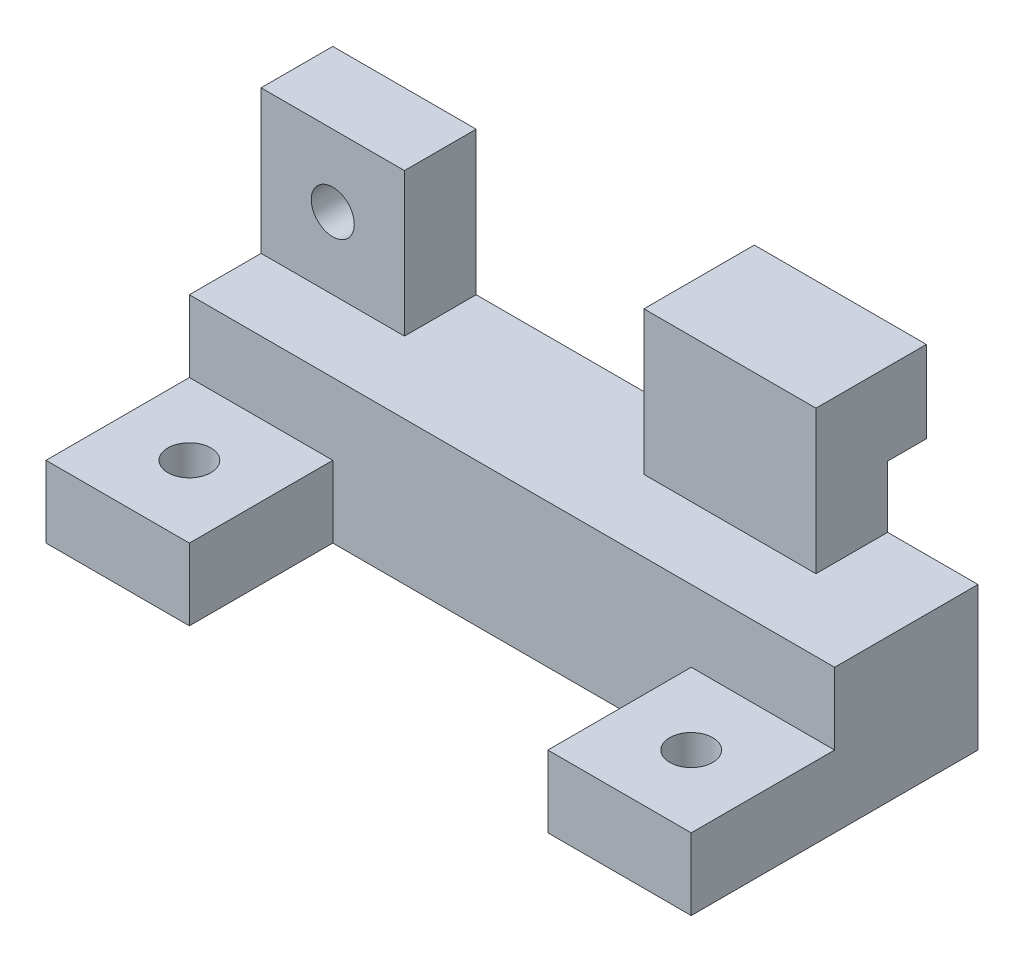
ISO-10303-21;
HEADER;
FILE_DESCRIPTION(('STEP AP214'),'2;1');
FILE_NAME('part.step','',(''),(''),'','','');
FILE_SCHEMA(('AUTOMOTIVE_DESIGN { 1 0 10303 214 1 1 1 1 }'));
ENDSEC;
DATA;
#1=APPLICATION_CONTEXT('core data for automotive mechanical design processes');
#2=APPLICATION_PROTOCOL_DEFINITION('international standard','automotive_design',2000,#1);
#3=PRODUCT_CONTEXT('',#1,'mechanical');
#4=PRODUCT('Part','Part','',(#3));
#5=PRODUCT_RELATED_PRODUCT_CATEGORY('part','',(#4));
#6=PRODUCT_DEFINITION_FORMATION('','',#4);
#7=PRODUCT_DEFINITION_CONTEXT('part definition',#1,'design');
#8=PRODUCT_DEFINITION('design','',#6,#7);
#9=PRODUCT_DEFINITION_SHAPE('','',#8);
#10=(LENGTH_UNIT() NAMED_UNIT(*) SI_UNIT(.MILLI.,.METRE.));
#11=(NAMED_UNIT(*) PLANE_ANGLE_UNIT() SI_UNIT($,.RADIAN.));
#12=(NAMED_UNIT(*) SI_UNIT($,.STERADIAN.) SOLID_ANGLE_UNIT());
#13=UNCERTAINTY_MEASURE_WITH_UNIT(LENGTH_MEASURE(1.E-05),#10,'distance_accuracy_value','');
#14=(GEOMETRIC_REPRESENTATION_CONTEXT(3) GLOBAL_UNCERTAINTY_ASSIGNED_CONTEXT((#13)) GLOBAL_UNIT_ASSIGNED_CONTEXT((#10,
#11,#12)) REPRESENTATION_CONTEXT('',''));
#15=CARTESIAN_POINT('',(0.,0.,0.));
#16=DIRECTION('',(0.,0.,1.));
#17=DIRECTION('',(1.,0.,0.));
#18=AXIS2_PLACEMENT_3D('',#15,#16,#17);
#19=CARTESIAN_POINT('',(0.,0.,10.));
#20=DIRECTION('',(0.,0.,-1.));
#21=DIRECTION('',(-1.,0.,0.));
#22=AXIS2_PLACEMENT_3D('',#19,#20,#21);
#23=PLANE('',#22);
#24=DIRECTION('',(-1.,0.,0.));
#25=VECTOR('',#24,1.);
#26=CARTESIAN_POINT('',(80.,5.,10.));
#27=LINE('',#26,#25);
#28=CARTESIAN_POINT('',(80.,5.,10.));
#29=VERTEX_POINT('',#28);
#30=CARTESIAN_POINT('',(70.,5.,10.));
#31=VERTEX_POINT('',#30);
#32=EDGE_CURVE('E356',#29,#31,#27,.T.);
#33=ORIENTED_EDGE('',*,*,#32,.F.);
#34=DIRECTION('',(0.,-1.,0.));
#35=VECTOR('',#34,1.);
#36=CARTESIAN_POINT('',(80.,10.,10.));
#37=LINE('',#36,#35);
#38=CARTESIAN_POINT('',(80.,10.,10.));
#39=VERTEX_POINT('',#38);
#40=EDGE_CURVE('E193',#39,#29,#37,.T.);
#41=ORIENTED_EDGE('',*,*,#40,.F.);
#42=DIRECTION('',(-1.,0.,0.));
#43=VECTOR('',#42,1.);
#44=CARTESIAN_POINT('',(0.,10.,10.));
#45=LINE('',#44,#43);
#46=CARTESIAN_POINT('',(35.,10.,10.));
#47=VERTEX_POINT('',#46);
#48=EDGE_CURVE('E312',#39,#47,#45,.T.);
#49=ORIENTED_EDGE('',*,*,#48,.T.);
#50=DIRECTION('',(0.,1.,0.));
#51=VECTOR('',#50,1.);
#52=CARTESIAN_POINT('',(35.,0.,10.));
#53=LINE('',#52,#51);
#54=CARTESIAN_POINT('',(35.,5.,10.));
#55=VERTEX_POINT('',#54);
#56=EDGE_CURVE('E194',#55,#47,#53,.T.);
#57=ORIENTED_EDGE('',*,*,#56,.F.);
#58=DIRECTION('',(-1.,0.,0.));
#59=VECTOR('',#58,1.);
#60=CARTESIAN_POINT('',(45.,5.,10.));
#61=LINE('',#60,#59);
#62=CARTESIAN_POINT('',(45.,5.,10.));
#63=VERTEX_POINT('',#62);
#64=EDGE_CURVE('E269',#63,#55,#61,.T.);
#65=ORIENTED_EDGE('',*,*,#64,.F.);
#66=DIRECTION('',(0.,-1.,0.));
#67=VECTOR('',#66,1.);
#68=CARTESIAN_POINT('',(45.,10.,10.));
#69=LINE('',#68,#67);
#70=CARTESIAN_POINT('',(45.,0.,10.));
#71=VERTEX_POINT('',#70);
#72=EDGE_CURVE('E11',#63,#71,#69,.T.);
#73=ORIENTED_EDGE('',*,*,#72,.T.);
#74=DIRECTION('',(-1.,0.,0.));
#75=VECTOR('',#74,1.);
#76=CARTESIAN_POINT('',(80.,0.,10.));
#77=LINE('',#76,#75);
#78=CARTESIAN_POINT('',(70.,0.,10.));
#79=VERTEX_POINT('',#78);
#80=EDGE_CURVE('E257',#79,#71,#77,.T.);
#81=ORIENTED_EDGE('',*,*,#80,.F.);
#82=DIRECTION('',(0.,-1.,0.));
#83=VECTOR('',#82,1.);
#84=CARTESIAN_POINT('',(70.,0.,10.));
#85=LINE('',#84,#83);
#86=EDGE_CURVE('E187',#31,#79,#85,.T.);
#87=ORIENTED_EDGE('',*,*,#86,.F.);
#88=EDGE_LOOP('',(#33,#41,#49,#57,#65,#73,#81,#87));
#89=FACE_BOUND('',#88,.T.);
#90=ADVANCED_FACE('F33',(#89),#23,.F.);
#91=CARTESIAN_POINT('',(0.,0.,0.));
#92=DIRECTION('',(0.,0.,-1.));
#93=DIRECTION('',(-1.,0.,0.));
#94=AXIS2_PLACEMENT_3D('',#91,#92,#93);
#95=PLANE('',#94);
#96=CARTESIAN_POINT('',(40.,15.,0.));
#97=DIRECTION('',(0.,0.,1.));
#98=DIRECTION('',(1.,0.,0.));
#99=AXIS2_PLACEMENT_3D('',#96,#97,#98);
#100=CIRCLE('',#99,1.5);
#101=CARTESIAN_POINT('',(41.5,15.,0.));
#102=VERTEX_POINT('',#101);
#103=EDGE_CURVE('E260',#102,#102,#100,.T.);
#104=ORIENTED_EDGE('',*,*,#103,.T.);
#105=EDGE_LOOP('',(#104));
#106=FACE_BOUND('',#105,.T.);
#107=DIRECTION('',(1.,0.,0.));
#108=VECTOR('',#107,1.);
#109=CARTESIAN_POINT('',(0.,0.,0.));
#110=LINE('',#109,#108);
#111=CARTESIAN_POINT('',(35.,0.,0.));
#112=VERTEX_POINT('',#111);
#113=CARTESIAN_POINT('',(80.,0.,0.));
#114=VERTEX_POINT('',#113);
#115=EDGE_CURVE('E311',#112,#114,#110,.T.);
#116=ORIENTED_EDGE('',*,*,#115,.F.);
#117=DIRECTION('',(0.,-1.,0.));
#118=VECTOR('',#117,1.);
#119=CARTESIAN_POINT('',(35.,20.,0.));
#120=LINE('',#119,#118);
#121=CARTESIAN_POINT('',(35.,20.,0.));
#122=VERTEX_POINT('',#121);
#123=EDGE_CURVE('E49',#122,#112,#120,.T.);
#124=ORIENTED_EDGE('',*,*,#123,.F.);
#125=DIRECTION('',(-1.,0.,0.));
#126=VECTOR('',#125,1.);
#127=CARTESIAN_POINT('',(45.,20.,0.));
#128=LINE('',#127,#126);
#129=CARTESIAN_POINT('',(45.,20.,0.));
#130=VERTEX_POINT('',#129);
#131=EDGE_CURVE('E296',#130,#122,#128,.T.);
#132=ORIENTED_EDGE('',*,*,#131,.F.);
#133=DIRECTION('',(0.,1.,0.));
#134=VECTOR('',#133,1.);
#135=CARTESIAN_POINT('',(45.,0.,0.));
#136=LINE('',#135,#134);
#137=CARTESIAN_POINT('',(45.,10.,0.));
#138=VERTEX_POINT('',#137);
#139=EDGE_CURVE('E315',#138,#130,#136,.T.);
#140=ORIENTED_EDGE('',*,*,#139,.F.);
#141=DIRECTION('',(-1.,0.,0.));
#142=VECTOR('',#141,1.);
#143=CARTESIAN_POINT('',(80.,10.,0.));
#144=LINE('',#143,#142);
#145=CARTESIAN_POINT('',(61.7,10.,0.));
#146=VERTEX_POINT('',#145);
#147=EDGE_CURVE('E251',#146,#138,#144,.T.);
#148=ORIENTED_EDGE('',*,*,#147,.F.);
#149=DIRECTION('',(0.,-1.,0.));
#150=VECTOR('',#149,1.);
#151=CARTESIAN_POINT('',(61.7,20.,0.));
#152=LINE('',#151,#150);
#153=CARTESIAN_POINT('',(61.7,14.3,0.));
#154=VERTEX_POINT('',#153);
#155=EDGE_CURVE('E230',#154,#146,#152,.T.);
#156=ORIENTED_EDGE('',*,*,#155,.F.);
#157=DIRECTION('',(-1.,0.,0.));
#158=VECTOR('',#157,1.);
#159=CARTESIAN_POINT('',(73.7,14.3,0.));
#160=LINE('',#159,#158);
#161=CARTESIAN_POINT('',(73.7,14.3,0.));
#162=VERTEX_POINT('',#161);
#163=EDGE_CURVE('E203',#162,#154,#160,.T.);
#164=ORIENTED_EDGE('',*,*,#163,.F.);
#165=DIRECTION('',(0.,-1.,0.));
#166=VECTOR('',#165,1.);
#167=CARTESIAN_POINT('',(73.7,20.,0.));
#168=LINE('',#167,#166);
#169=CARTESIAN_POINT('',(73.7,10.,0.));
#170=VERTEX_POINT('',#169);
#171=EDGE_CURVE('E237',#162,#170,#168,.T.);
#172=ORIENTED_EDGE('',*,*,#171,.T.);
#173=CARTESIAN_POINT('',(80.,10.,0.));
#174=VERTEX_POINT('',#173);
#175=EDGE_CURVE('E254',#174,#170,#144,.T.);
#176=ORIENTED_EDGE('',*,*,#175,.F.);
#177=DIRECTION('',(0.,1.,0.));
#178=VECTOR('',#177,1.);
#179=CARTESIAN_POINT('',(80.,10.,0.));
#180=LINE('',#179,#178);
#181=EDGE_CURVE('E248',#114,#174,#180,.T.);
#182=ORIENTED_EDGE('',*,*,#181,.F.);
#183=EDGE_LOOP('',(#116,#124,#132,#140,#148,#156,#164,#172,#176,#182));
#184=FACE_BOUND('',#183,.T.);
#185=ADVANCED_FACE('F325',(#106,#184),#95,.T.);
#186=CARTESIAN_POINT('',(0.,10.,10.));
#187=DIRECTION('',(0.,-1.,0.));
#188=DIRECTION('',(0.,0.,-1.));
#189=AXIS2_PLACEMENT_3D('',#186,#187,#188);
#190=PLANE('',#189);
#191=DIRECTION('',(0.,0.,-1.));
#192=VECTOR('',#191,1.);
#193=CARTESIAN_POINT('',(35.,10.,10.));
#194=LINE('',#193,#192);
#195=CARTESIAN_POINT('',(35.,10.,5.));
#196=VERTEX_POINT('',#195);
#197=EDGE_CURVE('E196',#47,#196,#194,.T.);
#198=ORIENTED_EDGE('',*,*,#197,.F.);
#199=ORIENTED_EDGE('',*,*,#48,.F.);
#200=DIRECTION('',(0.,0.,1.));
#201=VECTOR('',#200,1.);
#202=CARTESIAN_POINT('',(80.,10.,10.));
#203=LINE('',#202,#201);
#204=EDGE_CURVE('E250',#174,#39,#203,.T.);
#205=ORIENTED_EDGE('',*,*,#204,.F.);
#206=ORIENTED_EDGE('',*,*,#175,.T.);
#207=DIRECTION('',(0.,0.,-1.));
#208=VECTOR('',#207,1.);
#209=CARTESIAN_POINT('',(73.7,10.,0.));
#210=LINE('',#209,#208);
#211=CARTESIAN_POINT('',(73.7,10.,5.));
#212=VERTEX_POINT('',#211);
#213=EDGE_CURVE('E226',#212,#170,#210,.T.);
#214=ORIENTED_EDGE('',*,*,#213,.F.);
#215=DIRECTION('',(1.,0.,0.));
#216=VECTOR('',#215,1.);
#217=CARTESIAN_POINT('',(61.7,10.,5.));
#218=LINE('',#217,#216);
#219=CARTESIAN_POINT('',(61.7,10.,5.));
#220=VERTEX_POINT('',#219);
#221=EDGE_CURVE('E57',#220,#212,#218,.T.);
#222=ORIENTED_EDGE('',*,*,#221,.F.);
#223=DIRECTION('',(0.,0.,1.));
#224=VECTOR('',#223,1.);
#225=CARTESIAN_POINT('',(61.7,10.,0.));
#226=LINE('',#225,#224);
#227=EDGE_CURVE('E221',#146,#220,#226,.T.);
#228=ORIENTED_EDGE('',*,*,#227,.F.);
#229=ORIENTED_EDGE('',*,*,#147,.T.);
#230=DIRECTION('',(0.,0.,1.));
#231=VECTOR('',#230,1.);
#232=CARTESIAN_POINT('',(45.,10.,10.));
#233=LINE('',#232,#231);
#234=CARTESIAN_POINT('',(45.,10.,5.));
#235=VERTEX_POINT('',#234);
#236=EDGE_CURVE('E244',#138,#235,#233,.T.);
#237=ORIENTED_EDGE('',*,*,#236,.T.);
#238=DIRECTION('',(1.,0.,0.));
#239=VECTOR('',#238,1.);
#240=CARTESIAN_POINT('',(45.,10.,5.));
#241=LINE('',#240,#239);
#242=EDGE_CURVE('E292',#196,#235,#241,.T.);
#243=ORIENTED_EDGE('',*,*,#242,.F.);
#244=EDGE_LOOP('',(#198,#199,#205,#206,#214,#222,#228,#229,#237,#243));
#245=FACE_BOUND('',#244,.T.);
#246=ADVANCED_FACE('F335',(#245),#190,.F.);
#247=CARTESIAN_POINT('',(0.,0.,10.));
#248=DIRECTION('',(0.,1.,0.));
#249=DIRECTION('',(0.,0.,1.));
#250=AXIS2_PLACEMENT_3D('',#247,#248,#249);
#251=PLANE('',#250);
#252=CARTESIAN_POINT('',(75.,0.,15.));
#253=DIRECTION('',(0.,1.,0.));
#254=DIRECTION('',(-1.,0.,0.));
#255=AXIS2_PLACEMENT_3D('',#252,#253,#254);
#256=CIRCLE('',#255,1.5);
#257=CARTESIAN_POINT('',(73.5,0.,15.));
#258=VERTEX_POINT('',#257);
#259=EDGE_CURVE('E358',#258,#258,#256,.T.);
#260=ORIENTED_EDGE('',*,*,#259,.T.);
#261=EDGE_LOOP('',(#260));
#262=FACE_BOUND('',#261,.T.);
#263=CARTESIAN_POINT('',(40.,0.,15.));
#264=DIRECTION('',(0.,1.,0.));
#265=DIRECTION('',(-1.,0.,0.));
#266=AXIS2_PLACEMENT_3D('',#263,#264,#265);
#267=CIRCLE('',#266,1.5);
#268=CARTESIAN_POINT('',(38.5,0.,15.));
#269=VERTEX_POINT('',#268);
#270=EDGE_CURVE('E266',#269,#269,#267,.T.);
#271=ORIENTED_EDGE('',*,*,#270,.T.);
#272=EDGE_LOOP('',(#271));
#273=FACE_BOUND('',#272,.T.);
#274=DIRECTION('',(0.,0.,-1.));
#275=VECTOR('',#274,1.);
#276=CARTESIAN_POINT('',(35.,0.,20.));
#277=LINE('',#276,#275);
#278=CARTESIAN_POINT('',(35.,0.,20.));
#279=VERTEX_POINT('',#278);
#280=EDGE_CURVE('E282',#279,#112,#277,.T.);
#281=ORIENTED_EDGE('',*,*,#280,.T.);
#282=ORIENTED_EDGE('',*,*,#115,.T.);
#283=DIRECTION('',(0.,0.,-1.));
#284=VECTOR('',#283,1.);
#285=CARTESIAN_POINT('',(80.,0.,10.));
#286=LINE('',#285,#284);
#287=CARTESIAN_POINT('',(80.,0.,20.));
#288=VERTEX_POINT('',#287);
#289=EDGE_CURVE('E246',#288,#114,#286,.T.);
#290=ORIENTED_EDGE('',*,*,#289,.F.);
#291=DIRECTION('',(1.,0.,0.));
#292=VECTOR('',#291,1.);
#293=CARTESIAN_POINT('',(80.,0.,20.));
#294=LINE('',#293,#292);
#295=CARTESIAN_POINT('',(70.,0.,20.));
#296=VERTEX_POINT('',#295);
#297=EDGE_CURVE('E184',#296,#288,#294,.T.);
#298=ORIENTED_EDGE('',*,*,#297,.F.);
#299=DIRECTION('',(0.,0.,-1.));
#300=VECTOR('',#299,1.);
#301=CARTESIAN_POINT('',(70.,0.,20.));
#302=LINE('',#301,#300);
#303=EDGE_CURVE('E198',#296,#79,#302,.T.);
#304=ORIENTED_EDGE('',*,*,#303,.T.);
#305=ORIENTED_EDGE('',*,*,#80,.T.);
#306=DIRECTION('',(0.,0.,-1.));
#307=VECTOR('',#306,1.);
#308=CARTESIAN_POINT('',(45.,0.,10.));
#309=LINE('',#308,#307);
#310=CARTESIAN_POINT('',(45.,0.,20.));
#311=VERTEX_POINT('',#310);
#312=EDGE_CURVE('E37',#311,#71,#309,.T.);
#313=ORIENTED_EDGE('',*,*,#312,.F.);
#314=DIRECTION('',(1.,0.,0.));
#315=VECTOR('',#314,1.);
#316=CARTESIAN_POINT('',(45.,0.,20.));
#317=LINE('',#316,#315);
#318=EDGE_CURVE('E279',#279,#311,#317,.T.);
#319=ORIENTED_EDGE('',*,*,#318,.F.);
#320=EDGE_LOOP('',(#281,#282,#290,#298,#304,#305,#313,#319));
#321=FACE_BOUND('',#320,.T.);
#322=ADVANCED_FACE('F35',(#262,#273,#321),#251,.F.);
#323=CARTESIAN_POINT('',(45.,0.,10.));
#324=DIRECTION('',(-1.,0.,0.));
#325=DIRECTION('',(0.,0.,1.));
#326=AXIS2_PLACEMENT_3D('',#323,#324,#325);
#327=PLANE('',#326);
#328=ORIENTED_EDGE('',*,*,#72,.F.);
#329=DIRECTION('',(0.,0.,-1.));
#330=VECTOR('',#329,1.);
#331=CARTESIAN_POINT('',(45.,5.,20.));
#332=LINE('',#331,#330);
#333=CARTESIAN_POINT('',(45.,5.,20.));
#334=VERTEX_POINT('',#333);
#335=EDGE_CURVE('E289',#334,#63,#332,.T.);
#336=ORIENTED_EDGE('',*,*,#335,.F.);
#337=DIRECTION('',(0.,1.,0.));
#338=VECTOR('',#337,1.);
#339=CARTESIAN_POINT('',(45.,0.,20.));
#340=LINE('',#339,#338);
#341=EDGE_CURVE('E272',#311,#334,#340,.T.);
#342=ORIENTED_EDGE('',*,*,#341,.F.);
#343=ORIENTED_EDGE('',*,*,#312,.T.);
#344=EDGE_LOOP('',(#328,#336,#342,#343));
#345=FACE_BOUND('',#344,.T.);
#346=ADVANCED_FACE('F399',(#345),#327,.F.);
#347=ORIENTED_EDGE('',*,*,#236,.F.);
#348=ORIENTED_EDGE('',*,*,#139,.T.);
#349=DIRECTION('',(0.,0.,-1.));
#350=VECTOR('',#349,1.);
#351=CARTESIAN_POINT('',(45.,20.,0.));
#352=LINE('',#351,#350);
#353=CARTESIAN_POINT('',(45.,20.,5.));
#354=VERTEX_POINT('',#353);
#355=EDGE_CURVE('E293',#354,#130,#352,.T.);
#356=ORIENTED_EDGE('',*,*,#355,.F.);
#357=DIRECTION('',(0.,-1.,0.));
#358=VECTOR('',#357,1.);
#359=CARTESIAN_POINT('',(45.,20.,5.));
#360=LINE('',#359,#358);
#361=EDGE_CURVE('E302',#354,#235,#360,.T.);
#362=ORIENTED_EDGE('',*,*,#361,.T.);
#363=EDGE_LOOP('',(#347,#348,#356,#362));
#364=FACE_BOUND('',#363,.T.);
#365=ADVANCED_FACE('F321',(#364),#327,.F.);
#366=CARTESIAN_POINT('',(35.,20.,0.));
#367=DIRECTION('',(1.,0.,0.));
#368=DIRECTION('',(0.,0.,-1.));
#369=AXIS2_PLACEMENT_3D('',#366,#367,#368);
#370=PLANE('',#369);
#371=ORIENTED_EDGE('',*,*,#123,.T.);
#372=ORIENTED_EDGE('',*,*,#280,.F.);
#373=DIRECTION('',(0.,-1.,0.));
#374=VECTOR('',#373,1.);
#375=CARTESIAN_POINT('',(35.,0.,20.));
#376=LINE('',#375,#374);
#377=CARTESIAN_POINT('',(35.,5.,20.));
#378=VERTEX_POINT('',#377);
#379=EDGE_CURVE('E277',#378,#279,#376,.T.);
#380=ORIENTED_EDGE('',*,*,#379,.F.);
#381=DIRECTION('',(0.,0.,-1.));
#382=VECTOR('',#381,1.);
#383=CARTESIAN_POINT('',(35.,5.,20.));
#384=LINE('',#383,#382);
#385=EDGE_CURVE('E286',#378,#55,#384,.T.);
#386=ORIENTED_EDGE('',*,*,#385,.T.);
#387=ORIENTED_EDGE('',*,*,#56,.T.);
#388=ORIENTED_EDGE('',*,*,#197,.T.);
#389=DIRECTION('',(0.,-1.,0.));
#390=VECTOR('',#389,1.);
#391=CARTESIAN_POINT('',(35.,20.,5.));
#392=LINE('',#391,#390);
#393=CARTESIAN_POINT('',(35.,20.,5.));
#394=VERTEX_POINT('',#393);
#395=EDGE_CURVE('E307',#394,#196,#392,.T.);
#396=ORIENTED_EDGE('',*,*,#395,.F.);
#397=DIRECTION('',(0.,0.,1.));
#398=VECTOR('',#397,1.);
#399=CARTESIAN_POINT('',(35.,20.,0.));
#400=LINE('',#399,#398);
#401=EDGE_CURVE('E298',#122,#394,#400,.T.);
#402=ORIENTED_EDGE('',*,*,#401,.F.);
#403=EDGE_LOOP('',(#371,#372,#380,#386,#387,#388,#396,#402));
#404=FACE_BOUND('',#403,.T.);
#405=ADVANCED_FACE('F395',(#404),#370,.F.);
#406=CARTESIAN_POINT('',(45.,20.,5.));
#407=DIRECTION('',(0.,0.,-1.));
#408=DIRECTION('',(-1.,0.,0.));
#409=AXIS2_PLACEMENT_3D('',#406,#407,#408);
#410=PLANE('',#409);
#411=CARTESIAN_POINT('',(40.,15.,5.));
#412=DIRECTION('',(0.,0.,1.));
#413=DIRECTION('',(1.,0.,0.));
#414=AXIS2_PLACEMENT_3D('',#411,#412,#413);
#415=CIRCLE('',#414,1.5);
#416=CARTESIAN_POINT('',(41.5,15.,5.));
#417=VERTEX_POINT('',#416);
#418=EDGE_CURVE('E259',#417,#417,#415,.T.);
#419=ORIENTED_EDGE('',*,*,#418,.F.);
#420=EDGE_LOOP('',(#419));
#421=FACE_BOUND('',#420,.T.);
#422=ORIENTED_EDGE('',*,*,#242,.T.);
#423=ORIENTED_EDGE('',*,*,#361,.F.);
#424=DIRECTION('',(1.,0.,0.));
#425=VECTOR('',#424,1.);
#426=CARTESIAN_POINT('',(45.,20.,5.));
#427=LINE('',#426,#425);
#428=EDGE_CURVE('E300',#394,#354,#427,.T.);
#429=ORIENTED_EDGE('',*,*,#428,.F.);
#430=ORIENTED_EDGE('',*,*,#395,.T.);
#431=EDGE_LOOP('',(#422,#423,#429,#430));
#432=FACE_BOUND('',#431,.T.);
#433=ADVANCED_FACE('F332',(#421,#432),#410,.F.);
#434=CARTESIAN_POINT('',(0.,20.,0.));
#435=DIRECTION('',(0.,-1.,0.));
#436=DIRECTION('',(0.,0.,-1.));
#437=AXIS2_PLACEMENT_3D('',#434,#435,#436);
#438=PLANE('',#437);
#439=ORIENTED_EDGE('',*,*,#355,.T.);
#440=ORIENTED_EDGE('',*,*,#131,.T.);
#441=ORIENTED_EDGE('',*,*,#401,.T.);
#442=ORIENTED_EDGE('',*,*,#428,.T.);
#443=EDGE_LOOP('',(#439,#440,#441,#442));
#444=FACE_BOUND('',#443,.T.);
#445=ADVANCED_FACE('F327',(#444),#438,.F.);
#446=CARTESIAN_POINT('',(45.,5.,20.));
#447=DIRECTION('',(0.,-1.,0.));
#448=DIRECTION('',(1.,0.,0.));
#449=AXIS2_PLACEMENT_3D('',#446,#447,#448);
#450=PLANE('',#449);
#451=CARTESIAN_POINT('',(40.,5.,15.));
#452=DIRECTION('',(0.,1.,0.));
#453=DIRECTION('',(-1.,0.,0.));
#454=AXIS2_PLACEMENT_3D('',#451,#452,#453);
#455=CIRCLE('',#454,1.5);
#456=CARTESIAN_POINT('',(38.5,5.,15.));
#457=VERTEX_POINT('',#456);
#458=EDGE_CURVE('E263',#457,#457,#455,.T.);
#459=ORIENTED_EDGE('',*,*,#458,.F.);
#460=EDGE_LOOP('',(#459));
#461=FACE_BOUND('',#460,.T.);
#462=ORIENTED_EDGE('',*,*,#64,.T.);
#463=ORIENTED_EDGE('',*,*,#385,.F.);
#464=DIRECTION('',(-1.,0.,0.));
#465=VECTOR('',#464,1.);
#466=CARTESIAN_POINT('',(45.,5.,20.));
#467=LINE('',#466,#465);
#468=EDGE_CURVE('E275',#334,#378,#467,.T.);
#469=ORIENTED_EDGE('',*,*,#468,.F.);
#470=ORIENTED_EDGE('',*,*,#335,.T.);
#471=EDGE_LOOP('',(#462,#463,#469,#470));
#472=FACE_BOUND('',#471,.T.);
#473=ADVANCED_FACE('F413',(#461,#472),#450,.F.);
#474=CARTESIAN_POINT('',(0.,0.,20.));
#475=DIRECTION('',(0.,0.,1.));
#476=DIRECTION('',(1.,0.,0.));
#477=AXIS2_PLACEMENT_3D('',#474,#475,#476);
#478=PLANE('',#477);
#479=ORIENTED_EDGE('',*,*,#341,.T.);
#480=ORIENTED_EDGE('',*,*,#468,.T.);
#481=ORIENTED_EDGE('',*,*,#379,.T.);
#482=ORIENTED_EDGE('',*,*,#318,.T.);
#483=EDGE_LOOP('',(#479,#480,#481,#482));
#484=FACE_BOUND('',#483,.T.);
#485=ADVANCED_FACE('F416',(#484),#478,.T.);
#486=CARTESIAN_POINT('',(40.,0.,15.));
#487=DIRECTION('',(0.,1.,0.));
#488=DIRECTION('',(-1.,0.,0.));
#489=AXIS2_PLACEMENT_3D('',#486,#487,#488);
#490=CYLINDRICAL_SURFACE('',#489,1.5);
#491=ORIENTED_EDGE('',*,*,#270,.F.);
#492=EDGE_LOOP('',(#491));
#493=FACE_BOUND('',#492,.T.);
#494=ORIENTED_EDGE('',*,*,#458,.T.);
#495=EDGE_LOOP('',(#494));
#496=FACE_BOUND('',#495,.T.);
#497=ADVANCED_FACE('F434',(#493,#496),#490,.F.);
#498=CARTESIAN_POINT('',(40.,15.,0.));
#499=DIRECTION('',(0.,0.,1.));
#500=DIRECTION('',(1.,0.,0.));
#501=AXIS2_PLACEMENT_3D('',#498,#499,#500);
#502=CYLINDRICAL_SURFACE('',#501,1.5);
#503=ORIENTED_EDGE('',*,*,#103,.F.);
#504=EDGE_LOOP('',(#503));
#505=FACE_BOUND('',#504,.T.);
#506=ORIENTED_EDGE('',*,*,#418,.T.);
#507=EDGE_LOOP('',(#506));
#508=FACE_BOUND('',#507,.T.);
#509=ADVANCED_FACE('F437',(#505,#508),#502,.F.);
#510=CARTESIAN_POINT('',(80.,0.,0.));
#511=DIRECTION('',(1.,0.,0.));
#512=DIRECTION('',(0.,0.,-1.));
#513=AXIS2_PLACEMENT_3D('',#510,#511,#512);
#514=PLANE('',#513);
#515=ORIENTED_EDGE('',*,*,#40,.T.);
#516=DIRECTION('',(0.,0.,-1.));
#517=VECTOR('',#516,1.);
#518=CARTESIAN_POINT('',(80.,5.,20.));
#519=LINE('',#518,#517);
#520=CARTESIAN_POINT('',(80.,5.,20.));
#521=VERTEX_POINT('',#520);
#522=EDGE_CURVE('E171',#521,#29,#519,.T.);
#523=ORIENTED_EDGE('',*,*,#522,.F.);
#524=DIRECTION('',(0.,1.,0.));
#525=VECTOR('',#524,1.);
#526=CARTESIAN_POINT('',(80.,0.,20.));
#527=LINE('',#526,#525);
#528=EDGE_CURVE('E178',#288,#521,#527,.T.);
#529=ORIENTED_EDGE('',*,*,#528,.F.);
#530=ORIENTED_EDGE('',*,*,#289,.T.);
#531=ORIENTED_EDGE('',*,*,#181,.T.);
#532=ORIENTED_EDGE('',*,*,#204,.T.);
#533=EDGE_LOOP('',(#515,#523,#529,#530,#531,#532));
#534=FACE_BOUND('',#533,.T.);
#535=ADVANCED_FACE('F190',(#534),#514,.T.);
#536=CARTESIAN_POINT('',(61.7,20.,0.));
#537=DIRECTION('',(1.,0.,0.));
#538=DIRECTION('',(0.,0.,-1.));
#539=AXIS2_PLACEMENT_3D('',#536,#537,#538);
#540=PLANE('',#539);
#541=ORIENTED_EDGE('',*,*,#227,.T.);
#542=DIRECTION('',(0.,-1.,0.));
#543=VECTOR('',#542,1.);
#544=CARTESIAN_POINT('',(61.7,20.,5.));
#545=LINE('',#544,#543);
#546=CARTESIAN_POINT('',(61.7,20.,5.));
#547=VERTEX_POINT('',#546);
#548=EDGE_CURVE('E242',#547,#220,#545,.T.);
#549=ORIENTED_EDGE('',*,*,#548,.F.);
#550=DIRECTION('',(0.,0.,1.));
#551=VECTOR('',#550,1.);
#552=CARTESIAN_POINT('',(61.7,20.,0.));
#553=LINE('',#552,#551);
#554=CARTESIAN_POINT('',(61.7,20.,-2.7));
#555=VERTEX_POINT('',#554);
#556=EDGE_CURVE('E222',#555,#547,#553,.T.);
#557=ORIENTED_EDGE('',*,*,#556,.F.);
#558=DIRECTION('',(0.,1.,0.));
#559=VECTOR('',#558,1.);
#560=CARTESIAN_POINT('',(61.7,20.,-2.7));
#561=LINE('',#560,#559);
#562=CARTESIAN_POINT('',(61.7,14.3,-2.7));
#563=VERTEX_POINT('',#562);
#564=EDGE_CURVE('E209',#563,#555,#561,.T.);
#565=ORIENTED_EDGE('',*,*,#564,.F.);
#566=DIRECTION('',(0.,0.,1.));
#567=VECTOR('',#566,1.);
#568=CARTESIAN_POINT('',(61.7,14.3,-2.7));
#569=LINE('',#568,#567);
#570=EDGE_CURVE('E215',#563,#154,#569,.T.);
#571=ORIENTED_EDGE('',*,*,#570,.T.);
#572=ORIENTED_EDGE('',*,*,#155,.T.);
#573=EDGE_LOOP('',(#541,#549,#557,#565,#571,#572));
#574=FACE_BOUND('',#573,.T.);
#575=ADVANCED_FACE('F340',(#574),#540,.F.);
#576=CARTESIAN_POINT('',(61.7,20.,5.));
#577=DIRECTION('',(0.,0.,-1.));
#578=DIRECTION('',(-1.,0.,0.));
#579=AXIS2_PLACEMENT_3D('',#576,#577,#578);
#580=PLANE('',#579);
#581=ORIENTED_EDGE('',*,*,#221,.T.);
#582=DIRECTION('',(0.,-1.,0.));
#583=VECTOR('',#582,1.);
#584=CARTESIAN_POINT('',(73.7,20.,5.));
#585=LINE('',#584,#583);
#586=CARTESIAN_POINT('',(73.7,20.,5.));
#587=VERTEX_POINT('',#586);
#588=EDGE_CURVE('E239',#587,#212,#585,.T.);
#589=ORIENTED_EDGE('',*,*,#588,.F.);
#590=DIRECTION('',(1.,0.,0.));
#591=VECTOR('',#590,1.);
#592=CARTESIAN_POINT('',(61.7,20.,5.));
#593=LINE('',#592,#591);
#594=EDGE_CURVE('E225',#547,#587,#593,.T.);
#595=ORIENTED_EDGE('',*,*,#594,.F.);
#596=ORIENTED_EDGE('',*,*,#548,.T.);
#597=EDGE_LOOP('',(#581,#589,#595,#596));
#598=FACE_BOUND('',#597,.T.);
#599=ADVANCED_FACE('F446',(#598),#580,.F.);
#600=CARTESIAN_POINT('',(73.7,20.,0.));
#601=DIRECTION('',(-1.,0.,0.));
#602=DIRECTION('',(0.,0.,1.));
#603=AXIS2_PLACEMENT_3D('',#600,#601,#602);
#604=PLANE('',#603);
#605=ORIENTED_EDGE('',*,*,#213,.T.);
#606=ORIENTED_EDGE('',*,*,#171,.F.);
#607=DIRECTION('',(0.,0.,1.));
#608=VECTOR('',#607,1.);
#609=CARTESIAN_POINT('',(73.7,14.3,-2.7));
#610=LINE('',#609,#608);
#611=CARTESIAN_POINT('',(73.7,14.3,-2.7));
#612=VERTEX_POINT('',#611);
#613=EDGE_CURVE('E219',#612,#162,#610,.T.);
#614=ORIENTED_EDGE('',*,*,#613,.F.);
#615=DIRECTION('',(0.,-1.,0.));
#616=VECTOR('',#615,1.);
#617=CARTESIAN_POINT('',(73.7,20.,-2.7));
#618=LINE('',#617,#616);
#619=CARTESIAN_POINT('',(73.7,20.,-2.7));
#620=VERTEX_POINT('',#619);
#621=EDGE_CURVE('E204',#620,#612,#618,.T.);
#622=ORIENTED_EDGE('',*,*,#621,.F.);
#623=DIRECTION('',(0.,0.,-1.));
#624=VECTOR('',#623,1.);
#625=CARTESIAN_POINT('',(73.7,20.,0.));
#626=LINE('',#625,#624);
#627=EDGE_CURVE('E228',#587,#620,#626,.T.);
#628=ORIENTED_EDGE('',*,*,#627,.F.);
#629=ORIENTED_EDGE('',*,*,#588,.T.);
#630=EDGE_LOOP('',(#605,#606,#614,#622,#628,#629));
#631=FACE_BOUND('',#630,.T.);
#632=ADVANCED_FACE('F349',(#631),#604,.F.);
#633=CARTESIAN_POINT('',(0.,20.,0.));
#634=DIRECTION('',(0.,1.,0.));
#635=DIRECTION('',(0.,0.,1.));
#636=AXIS2_PLACEMENT_3D('',#633,#634,#635);
#637=PLANE('',#636);
#638=ORIENTED_EDGE('',*,*,#556,.T.);
#639=ORIENTED_EDGE('',*,*,#594,.T.);
#640=ORIENTED_EDGE('',*,*,#627,.T.);
#641=DIRECTION('',(1.,0.,0.));
#642=VECTOR('',#641,1.);
#643=CARTESIAN_POINT('',(73.7,20.,-2.7));
#644=LINE('',#643,#642);
#645=EDGE_CURVE('E212',#555,#620,#644,.T.);
#646=ORIENTED_EDGE('',*,*,#645,.F.);
#647=EDGE_LOOP('',(#638,#639,#640,#646));
#648=FACE_BOUND('',#647,.T.);
#649=ADVANCED_FACE('F452',(#648),#637,.T.);
#650=CARTESIAN_POINT('',(73.7,14.3,-2.7));
#651=DIRECTION('',(0.,1.,0.));
#652=DIRECTION('',(0.,0.,1.));
#653=AXIS2_PLACEMENT_3D('',#650,#651,#652);
#654=PLANE('',#653);
#655=ORIENTED_EDGE('',*,*,#163,.T.);
#656=ORIENTED_EDGE('',*,*,#570,.F.);
#657=DIRECTION('',(-1.,0.,0.));
#658=VECTOR('',#657,1.);
#659=CARTESIAN_POINT('',(73.7,14.3,-2.7));
#660=LINE('',#659,#658);
#661=EDGE_CURVE('E207',#612,#563,#660,.T.);
#662=ORIENTED_EDGE('',*,*,#661,.F.);
#663=ORIENTED_EDGE('',*,*,#613,.T.);
#664=EDGE_LOOP('',(#655,#656,#662,#663));
#665=FACE_BOUND('',#664,.T.);
#666=ADVANCED_FACE('F345',(#665),#654,.F.);
#667=CARTESIAN_POINT('',(0.,0.,-2.7));
#668=DIRECTION('',(0.,0.,-1.));
#669=DIRECTION('',(-1.,0.,0.));
#670=AXIS2_PLACEMENT_3D('',#667,#668,#669);
#671=PLANE('',#670);
#672=ORIENTED_EDGE('',*,*,#621,.T.);
#673=ORIENTED_EDGE('',*,*,#661,.T.);
#674=ORIENTED_EDGE('',*,*,#564,.T.);
#675=ORIENTED_EDGE('',*,*,#645,.T.);
#676=EDGE_LOOP('',(#672,#673,#674,#675));
#677=FACE_BOUND('',#676,.T.);
#678=ADVANCED_FACE('F377',(#677),#671,.T.);
#679=CARTESIAN_POINT('',(80.,5.,20.));
#680=DIRECTION('',(0.,-1.,0.));
#681=DIRECTION('',(1.,0.,0.));
#682=AXIS2_PLACEMENT_3D('',#679,#680,#681);
#683=PLANE('',#682);
#684=CARTESIAN_POINT('',(75.,5.,15.));
#685=DIRECTION('',(0.,1.,0.));
#686=DIRECTION('',(-1.,0.,0.));
#687=AXIS2_PLACEMENT_3D('',#684,#685,#686);
#688=CIRCLE('',#687,1.5);
#689=CARTESIAN_POINT('',(73.5,5.,15.));
#690=VERTEX_POINT('',#689);
#691=EDGE_CURVE('E362',#690,#690,#688,.T.);
#692=ORIENTED_EDGE('',*,*,#691,.F.);
#693=EDGE_LOOP('',(#692));
#694=FACE_BOUND('',#693,.T.);
#695=ORIENTED_EDGE('',*,*,#32,.T.);
#696=DIRECTION('',(0.,0.,-1.));
#697=VECTOR('',#696,1.);
#698=CARTESIAN_POINT('',(70.,5.,20.));
#699=LINE('',#698,#697);
#700=CARTESIAN_POINT('',(70.,5.,20.));
#701=VERTEX_POINT('',#700);
#702=EDGE_CURVE('E174',#701,#31,#699,.T.);
#703=ORIENTED_EDGE('',*,*,#702,.F.);
#704=DIRECTION('',(-1.,0.,0.));
#705=VECTOR('',#704,1.);
#706=CARTESIAN_POINT('',(80.,5.,20.));
#707=LINE('',#706,#705);
#708=EDGE_CURVE('E167',#521,#701,#707,.T.);
#709=ORIENTED_EDGE('',*,*,#708,.F.);
#710=ORIENTED_EDGE('',*,*,#522,.T.);
#711=EDGE_LOOP('',(#695,#703,#709,#710));
#712=FACE_BOUND('',#711,.T.);
#713=ADVANCED_FACE('F169',(#694,#712),#683,.F.);
#714=CARTESIAN_POINT('',(70.,0.,20.));
#715=DIRECTION('',(1.,0.,0.));
#716=DIRECTION('',(0.,0.,-1.));
#717=AXIS2_PLACEMENT_3D('',#714,#715,#716);
#718=PLANE('',#717);
#719=ORIENTED_EDGE('',*,*,#86,.T.);
#720=ORIENTED_EDGE('',*,*,#303,.F.);
#721=DIRECTION('',(0.,-1.,0.));
#722=VECTOR('',#721,1.);
#723=CARTESIAN_POINT('',(70.,0.,20.));
#724=LINE('',#723,#722);
#725=EDGE_CURVE('E177',#701,#296,#724,.T.);
#726=ORIENTED_EDGE('',*,*,#725,.F.);
#727=ORIENTED_EDGE('',*,*,#702,.T.);
#728=EDGE_LOOP('',(#719,#720,#726,#727));
#729=FACE_BOUND('',#728,.T.);
#730=ADVANCED_FACE('F376',(#729),#718,.F.);
#731=CARTESIAN_POINT('',(0.,0.,20.));
#732=DIRECTION('',(0.,0.,1.));
#733=DIRECTION('',(1.,0.,0.));
#734=AXIS2_PLACEMENT_3D('',#731,#732,#733);
#735=PLANE('',#734);
#736=ORIENTED_EDGE('',*,*,#528,.T.);
#737=ORIENTED_EDGE('',*,*,#708,.T.);
#738=ORIENTED_EDGE('',*,*,#725,.T.);
#739=ORIENTED_EDGE('',*,*,#297,.T.);
#740=EDGE_LOOP('',(#736,#737,#738,#739));
#741=FACE_BOUND('',#740,.T.);
#742=ADVANCED_FACE('F182',(#741),#735,.T.);
#743=CARTESIAN_POINT('',(75.,0.,15.));
#744=DIRECTION('',(0.,1.,0.));
#745=DIRECTION('',(-1.,0.,0.));
#746=AXIS2_PLACEMENT_3D('',#743,#744,#745);
#747=CYLINDRICAL_SURFACE('',#746,1.5);
#748=ORIENTED_EDGE('',*,*,#259,.F.);
#749=EDGE_LOOP('',(#748));
#750=FACE_BOUND('',#749,.T.);
#751=ORIENTED_EDGE('',*,*,#691,.T.);
#752=EDGE_LOOP('',(#751));
#753=FACE_BOUND('',#752,.T.);
#754=ADVANCED_FACE('F373',(#750,#753),#747,.F.);
#755=CLOSED_SHELL('',(#90,#185,#246,#322,#346,#365,#405,#433,#445,#473,#485,#497,#509,#535,#575,
#599,#632,#649,#666,#678,#713,#730,#742,#754));
#756=MANIFOLD_SOLID_BREP('B2',#755);
#757=ADVANCED_BREP_SHAPE_REPRESENTATION('',(#18,#756),#14);
#758=SHAPE_DEFINITION_REPRESENTATION(#9,#757);
ENDSEC;
END-ISO-10303-21;
